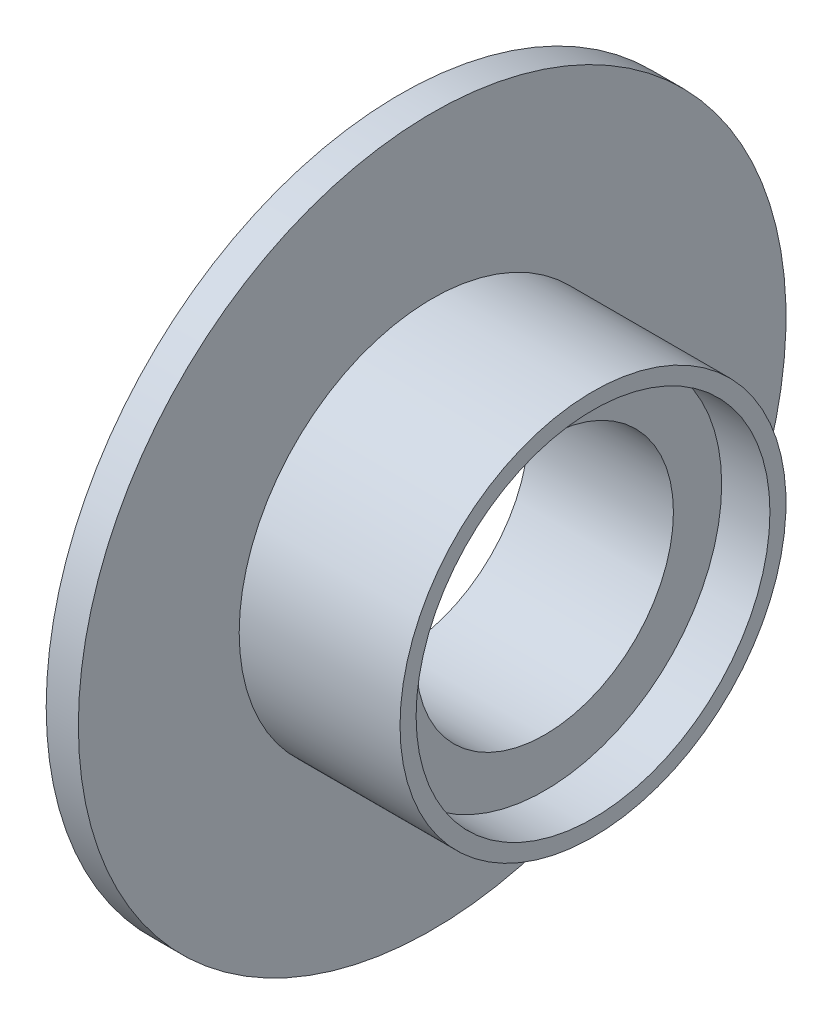
ISO-10303-21;
HEADER;
FILE_DESCRIPTION(('STEP AP214'),'2;1');
FILE_NAME('part.step','',(''),(''),'','','');
FILE_SCHEMA(('AUTOMOTIVE_DESIGN { 1 0 10303 214 1 1 1 1 }'));
ENDSEC;
DATA;
#1=APPLICATION_CONTEXT('core data for automotive mechanical design processes');
#2=APPLICATION_PROTOCOL_DEFINITION('international standard','automotive_design',2000,#1);
#3=PRODUCT_CONTEXT('',#1,'mechanical');
#4=PRODUCT('Part','Part','',(#3));
#5=PRODUCT_RELATED_PRODUCT_CATEGORY('part','',(#4));
#6=PRODUCT_DEFINITION_FORMATION('','',#4);
#7=PRODUCT_DEFINITION_CONTEXT('part definition',#1,'design');
#8=PRODUCT_DEFINITION('design','',#6,#7);
#9=PRODUCT_DEFINITION_SHAPE('','',#8);
#10=(LENGTH_UNIT() NAMED_UNIT(*) SI_UNIT(.MILLI.,.METRE.));
#11=(NAMED_UNIT(*) PLANE_ANGLE_UNIT() SI_UNIT($,.RADIAN.));
#12=(NAMED_UNIT(*) SI_UNIT($,.STERADIAN.) SOLID_ANGLE_UNIT());
#13=UNCERTAINTY_MEASURE_WITH_UNIT(LENGTH_MEASURE(1.E-05),#10,'distance_accuracy_value','');
#14=(GEOMETRIC_REPRESENTATION_CONTEXT(3) GLOBAL_UNCERTAINTY_ASSIGNED_CONTEXT((#13)) GLOBAL_UNIT_ASSIGNED_CONTEXT((#10,
#11,#12)) REPRESENTATION_CONTEXT('',''));
#15=CARTESIAN_POINT('',(0.,0.,0.));
#16=DIRECTION('',(0.,0.,1.));
#17=DIRECTION('',(1.,0.,0.));
#18=AXIS2_PLACEMENT_3D('',#15,#16,#17);
#19=CARTESIAN_POINT('',(0.,0.,0.));
#20=DIRECTION('',(-1.,0.,0.));
#21=DIRECTION('',(0.,0.,1.));
#22=AXIS2_PLACEMENT_3D('',#19,#20,#21);
#23=CYLINDRICAL_SURFACE('',#22,22.);
#24=CARTESIAN_POINT('',(0.,0.,0.));
#25=DIRECTION('',(-1.,0.,0.));
#26=DIRECTION('',(0.,0.,1.));
#27=AXIS2_PLACEMENT_3D('',#24,#25,#26);
#28=CIRCLE('',#27,22.);
#29=CARTESIAN_POINT('',(0.,0.,22.));
#30=VERTEX_POINT('',#29);
#31=EDGE_CURVE('E58',#30,#30,#28,.T.);
#32=ORIENTED_EDGE('',*,*,#31,.F.);
#33=EDGE_LOOP('',(#32));
#34=FACE_BOUND('',#33,.T.);
#35=CARTESIAN_POINT('',(2.,0.,0.));
#36=DIRECTION('',(-1.,0.,0.));
#37=DIRECTION('',(0.,0.,1.));
#38=AXIS2_PLACEMENT_3D('',#35,#36,#37);
#39=CIRCLE('',#38,22.);
#40=CARTESIAN_POINT('',(2.,0.,22.));
#41=VERTEX_POINT('',#40);
#42=EDGE_CURVE('E10',#41,#41,#39,.T.);
#43=ORIENTED_EDGE('',*,*,#42,.T.);
#44=EDGE_LOOP('',(#43));
#45=FACE_BOUND('',#44,.T.);
#46=ADVANCED_FACE('F30',(#34,#45),#23,.T.);
#47=CARTESIAN_POINT('',(2.,0.,-22.));
#48=DIRECTION('',(-1.,0.,0.));
#49=DIRECTION('',(0.,0.,1.));
#50=AXIS2_PLACEMENT_3D('',#47,#48,#49);
#51=PLANE('',#50);
#52=ORIENTED_EDGE('',*,*,#42,.F.);
#53=EDGE_LOOP('',(#52));
#54=FACE_BOUND('',#53,.T.);
#55=CARTESIAN_POINT('',(2.,0.,0.));
#56=DIRECTION('',(-1.,0.,0.));
#57=DIRECTION('',(0.,0.,1.));
#58=AXIS2_PLACEMENT_3D('',#55,#56,#57);
#59=CIRCLE('',#58,12.);
#60=CARTESIAN_POINT('',(2.,0.,12.));
#61=VERTEX_POINT('',#60);
#62=EDGE_CURVE('E36',#61,#61,#59,.T.);
#63=ORIENTED_EDGE('',*,*,#62,.T.);
#64=EDGE_LOOP('',(#63));
#65=FACE_BOUND('',#64,.T.);
#66=ADVANCED_FACE('F65',(#54,#65),#51,.F.);
#67=CARTESIAN_POINT('',(0.,0.,0.));
#68=DIRECTION('',(-1.,0.,0.));
#69=DIRECTION('',(0.,0.,1.));
#70=AXIS2_PLACEMENT_3D('',#67,#68,#69);
#71=CYLINDRICAL_SURFACE('',#70,12.);
#72=ORIENTED_EDGE('',*,*,#62,.F.);
#73=EDGE_LOOP('',(#72));
#74=FACE_BOUND('',#73,.T.);
#75=CARTESIAN_POINT('',(12.,0.,0.));
#76=DIRECTION('',(-1.,0.,0.));
#77=DIRECTION('',(0.,0.,1.));
#78=AXIS2_PLACEMENT_3D('',#75,#76,#77);
#79=CIRCLE('',#78,12.);
#80=CARTESIAN_POINT('',(12.,0.,12.));
#81=VERTEX_POINT('',#80);
#82=EDGE_CURVE('E40',#81,#81,#79,.T.);
#83=ORIENTED_EDGE('',*,*,#82,.T.);
#84=EDGE_LOOP('',(#83));
#85=FACE_BOUND('',#84,.T.);
#86=ADVANCED_FACE('F69',(#74,#85),#71,.T.);
#87=CARTESIAN_POINT('',(12.,0.,-12.));
#88=DIRECTION('',(-1.,0.,0.));
#89=DIRECTION('',(0.,0.,1.));
#90=AXIS2_PLACEMENT_3D('',#87,#88,#89);
#91=PLANE('',#90);
#92=ORIENTED_EDGE('',*,*,#82,.F.);
#93=EDGE_LOOP('',(#92));
#94=FACE_BOUND('',#93,.T.);
#95=CARTESIAN_POINT('',(12.,0.,0.));
#96=DIRECTION('',(-1.,0.,0.));
#97=DIRECTION('',(0.,0.,1.));
#98=AXIS2_PLACEMENT_3D('',#95,#96,#97);
#99=CIRCLE('',#98,11.);
#100=CARTESIAN_POINT('',(12.,0.,11.));
#101=VERTEX_POINT('',#100);
#102=EDGE_CURVE('E44',#101,#101,#99,.T.);
#103=ORIENTED_EDGE('',*,*,#102,.T.);
#104=EDGE_LOOP('',(#103));
#105=FACE_BOUND('',#104,.T.);
#106=ADVANCED_FACE('F74',(#94,#105),#91,.F.);
#107=CARTESIAN_POINT('',(0.,0.,0.));
#108=DIRECTION('',(-1.,0.,0.));
#109=DIRECTION('',(0.,0.,1.));
#110=AXIS2_PLACEMENT_3D('',#107,#108,#109);
#111=CYLINDRICAL_SURFACE('',#110,11.);
#112=ORIENTED_EDGE('',*,*,#102,.F.);
#113=EDGE_LOOP('',(#112));
#114=FACE_BOUND('',#113,.T.);
#115=CARTESIAN_POINT('',(9.,0.,0.));
#116=DIRECTION('',(-1.,0.,0.));
#117=DIRECTION('',(0.,0.,1.));
#118=AXIS2_PLACEMENT_3D('',#115,#116,#117);
#119=CIRCLE('',#118,11.);
#120=CARTESIAN_POINT('',(9.,0.,11.));
#121=VERTEX_POINT('',#120);
#122=EDGE_CURVE('E49',#121,#121,#119,.T.);
#123=ORIENTED_EDGE('',*,*,#122,.T.);
#124=EDGE_LOOP('',(#123));
#125=FACE_BOUND('',#124,.T.);
#126=ADVANCED_FACE('F80',(#114,#125),#111,.F.);
#127=CARTESIAN_POINT('',(9.,0.,-11.));
#128=DIRECTION('',(-1.,0.,0.));
#129=DIRECTION('',(0.,0.,1.));
#130=AXIS2_PLACEMENT_3D('',#127,#128,#129);
#131=PLANE('',#130);
#132=ORIENTED_EDGE('',*,*,#122,.F.);
#133=EDGE_LOOP('',(#132));
#134=FACE_BOUND('',#133,.T.);
#135=CARTESIAN_POINT('',(9.,0.,0.));
#136=DIRECTION('',(-1.,0.,0.));
#137=DIRECTION('',(0.,0.,1.));
#138=AXIS2_PLACEMENT_3D('',#135,#136,#137);
#139=CIRCLE('',#138,8.);
#140=CARTESIAN_POINT('',(9.,0.,8.));
#141=VERTEX_POINT('',#140);
#142=EDGE_CURVE('E52',#141,#141,#139,.T.);
#143=ORIENTED_EDGE('',*,*,#142,.T.);
#144=EDGE_LOOP('',(#143));
#145=FACE_BOUND('',#144,.T.);
#146=ADVANCED_FACE('F84',(#134,#145),#131,.F.);
#147=CARTESIAN_POINT('',(0.,0.,0.));
#148=DIRECTION('',(-1.,0.,0.));
#149=DIRECTION('',(0.,0.,1.));
#150=AXIS2_PLACEMENT_3D('',#147,#148,#149);
#151=CYLINDRICAL_SURFACE('',#150,8.);
#152=ORIENTED_EDGE('',*,*,#142,.F.);
#153=EDGE_LOOP('',(#152));
#154=FACE_BOUND('',#153,.T.);
#155=CARTESIAN_POINT('',(0.,0.,0.));
#156=DIRECTION('',(-1.,0.,0.));
#157=DIRECTION('',(0.,0.,1.));
#158=AXIS2_PLACEMENT_3D('',#155,#156,#157);
#159=CIRCLE('',#158,8.);
#160=CARTESIAN_POINT('',(0.,0.,8.));
#161=VERTEX_POINT('',#160);
#162=EDGE_CURVE('E55',#161,#161,#159,.T.);
#163=ORIENTED_EDGE('',*,*,#162,.T.);
#164=EDGE_LOOP('',(#163));
#165=FACE_BOUND('',#164,.T.);
#166=ADVANCED_FACE('F88',(#154,#165),#151,.F.);
#167=CARTESIAN_POINT('',(0.,0.,-8.));
#168=DIRECTION('',(1.,0.,0.));
#169=DIRECTION('',(0.,0.,-1.));
#170=AXIS2_PLACEMENT_3D('',#167,#168,#169);
#171=PLANE('',#170);
#172=ORIENTED_EDGE('',*,*,#162,.F.);
#173=EDGE_LOOP('',(#172));
#174=FACE_BOUND('',#173,.T.);
#175=ORIENTED_EDGE('',*,*,#31,.T.);
#176=EDGE_LOOP('',(#175));
#177=FACE_BOUND('',#176,.T.);
#178=ADVANCED_FACE('F62',(#174,#177),#171,.F.);
#179=CLOSED_SHELL('',(#46,#66,#86,#106,#126,#146,#166,#178));
#180=MANIFOLD_SOLID_BREP('B2',#179);
#181=ADVANCED_BREP_SHAPE_REPRESENTATION('',(#18,#180),#14);
#182=SHAPE_DEFINITION_REPRESENTATION(#9,#181);
ENDSEC;
END-ISO-10303-21;
